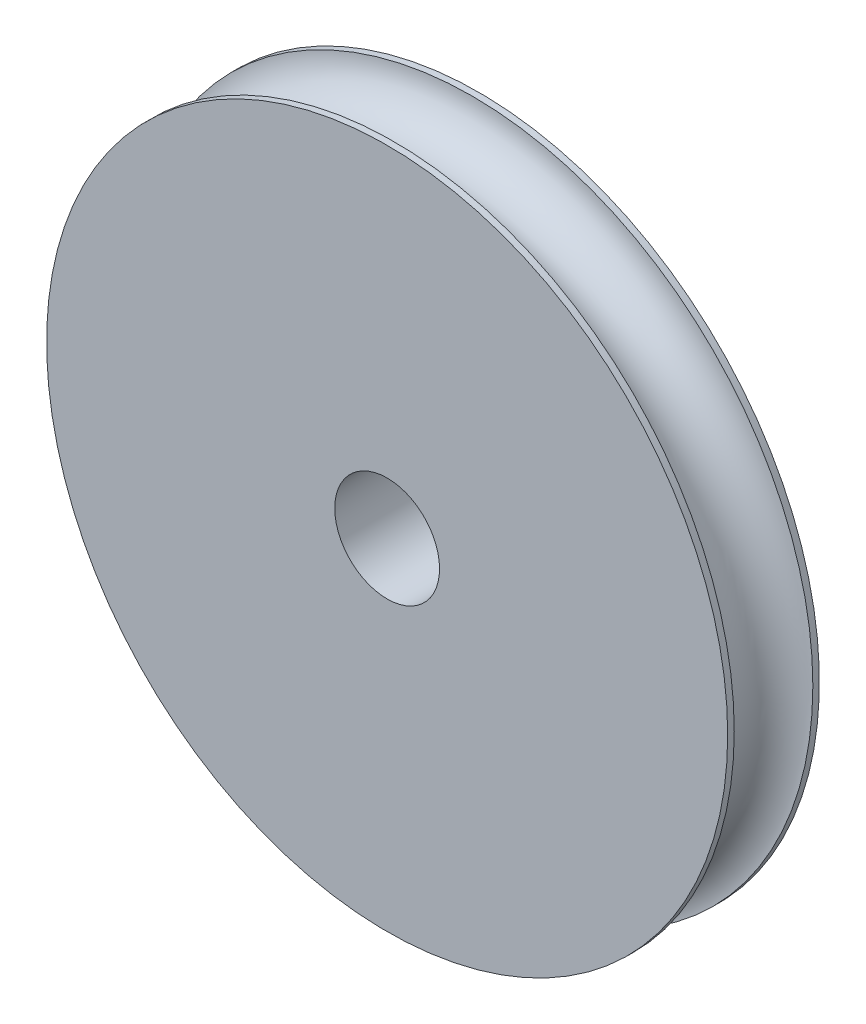
ISO-10303-21;
HEADER;
FILE_DESCRIPTION(('STEP AP214'),'2;1');
FILE_NAME('part.step','',(''),(''),'','','');
FILE_SCHEMA(('AUTOMOTIVE_DESIGN { 1 0 10303 214 1 1 1 1 }'));
ENDSEC;
DATA;
#1=APPLICATION_CONTEXT('core data for automotive mechanical design processes');
#2=APPLICATION_PROTOCOL_DEFINITION('international standard','automotive_design',2000,#1);
#3=PRODUCT_CONTEXT('',#1,'mechanical');
#4=PRODUCT('Part','Part','',(#3));
#5=PRODUCT_RELATED_PRODUCT_CATEGORY('part','',(#4));
#6=PRODUCT_DEFINITION_FORMATION('','',#4);
#7=PRODUCT_DEFINITION_CONTEXT('part definition',#1,'design');
#8=PRODUCT_DEFINITION('design','',#6,#7);
#9=PRODUCT_DEFINITION_SHAPE('','',#8);
#10=(LENGTH_UNIT() NAMED_UNIT(*) SI_UNIT(.MILLI.,.METRE.));
#11=(NAMED_UNIT(*) PLANE_ANGLE_UNIT() SI_UNIT($,.RADIAN.));
#12=(NAMED_UNIT(*) SI_UNIT($,.STERADIAN.) SOLID_ANGLE_UNIT());
#13=UNCERTAINTY_MEASURE_WITH_UNIT(LENGTH_MEASURE(1.E-05),#10,'distance_accuracy_value','');
#14=(GEOMETRIC_REPRESENTATION_CONTEXT(3) GLOBAL_UNCERTAINTY_ASSIGNED_CONTEXT((#13)) GLOBAL_UNIT_ASSIGNED_CONTEXT((#10,
#11,#12)) REPRESENTATION_CONTEXT('',''));
#15=CARTESIAN_POINT('',(0.,0.,0.));
#16=DIRECTION('',(0.,0.,1.));
#17=DIRECTION('',(1.,0.,0.));
#18=AXIS2_PLACEMENT_3D('',#15,#16,#17);
#19=CARTESIAN_POINT('',(0.,0.,-3.));
#20=DIRECTION('',(0.,0.,1.));
#21=DIRECTION('',(1.,0.,0.));
#22=AXIS2_PLACEMENT_3D('',#19,#20,#21);
#23=TOROIDAL_SURFACE('',#22,26.,3.);
#24=CARTESIAN_POINT('',(0.,0.,0.));
#25=DIRECTION('',(0.,0.,1.));
#26=DIRECTION('',(1.,0.,0.));
#27=AXIS2_PLACEMENT_3D('',#24,#25,#26);
#28=CIRCLE('',#27,26.);
#29=CARTESIAN_POINT('',(26.,0.,0.));
#30=VERTEX_POINT('',#29);
#31=EDGE_CURVE('E10',#30,#30,#28,.T.);
#32=ORIENTED_EDGE('',*,*,#31,.F.);
#33=EDGE_LOOP('',(#32));
#34=FACE_BOUND('',#33,.T.);
#35=CARTESIAN_POINT('',(0.,0.,-6.));
#36=DIRECTION('',(0.,0.,-1.));
#37=DIRECTION('',(-1.,0.,0.));
#38=AXIS2_PLACEMENT_3D('',#35,#36,#37);
#39=CIRCLE('',#38,26.);
#40=CARTESIAN_POINT('',(-26.,0.,-6.));
#41=VERTEX_POINT('',#40);
#42=EDGE_CURVE('E47',#41,#41,#39,.T.);
#43=ORIENTED_EDGE('',*,*,#42,.F.);
#44=EDGE_LOOP('',(#43));
#45=FACE_BOUND('',#44,.T.);
#46=ADVANCED_FACE('F33',(#34,#45),#23,.F.);
#47=CARTESIAN_POINT('',(0.,0.,0.5));
#48=DIRECTION('',(0.,0.,1.));
#49=DIRECTION('',(1.,0.,0.));
#50=AXIS2_PLACEMENT_3D('',#47,#48,#49);
#51=PLANE('',#50);
#52=CARTESIAN_POINT('',(0.,0.,0.5));
#53=DIRECTION('',(0.,0.,1.));
#54=DIRECTION('',(1.,0.,0.));
#55=AXIS2_PLACEMENT_3D('',#52,#53,#54);
#56=CIRCLE('',#55,4.);
#57=CARTESIAN_POINT('',(4.,0.,0.5));
#58=VERTEX_POINT('',#57);
#59=EDGE_CURVE('E51',#58,#58,#56,.T.);
#60=ORIENTED_EDGE('',*,*,#59,.F.);
#61=EDGE_LOOP('',(#60));
#62=FACE_BOUND('',#61,.T.);
#63=CARTESIAN_POINT('',(0.,0.,0.5));
#64=DIRECTION('',(0.,0.,1.));
#65=DIRECTION('',(1.,0.,0.));
#66=AXIS2_PLACEMENT_3D('',#63,#64,#65);
#67=CIRCLE('',#66,26.);
#68=CARTESIAN_POINT('',(26.,0.,0.5));
#69=VERTEX_POINT('',#68);
#70=EDGE_CURVE('E39',#69,#69,#67,.T.);
#71=ORIENTED_EDGE('',*,*,#70,.T.);
#72=EDGE_LOOP('',(#71));
#73=FACE_BOUND('',#72,.T.);
#74=ADVANCED_FACE('F75',(#62,#73),#51,.T.);
#75=CARTESIAN_POINT('',(0.,0.,0.5));
#76=DIRECTION('',(0.,0.,-1.));
#77=DIRECTION('',(-1.,0.,0.));
#78=AXIS2_PLACEMENT_3D('',#75,#76,#77);
#79=CYLINDRICAL_SURFACE('',#78,26.);
#80=ORIENTED_EDGE('',*,*,#70,.F.);
#81=EDGE_LOOP('',(#80));
#82=FACE_BOUND('',#81,.T.);
#83=ORIENTED_EDGE('',*,*,#31,.T.);
#84=EDGE_LOOP('',(#83));
#85=FACE_BOUND('',#84,.T.);
#86=ADVANCED_FACE('F70',(#82,#85),#79,.T.);
#87=CARTESIAN_POINT('',(0.,0.,-6.5));
#88=DIRECTION('',(0.,0.,1.));
#89=DIRECTION('',(1.,0.,0.));
#90=AXIS2_PLACEMENT_3D('',#87,#88,#89);
#91=CYLINDRICAL_SURFACE('',#90,26.);
#92=CARTESIAN_POINT('',(0.,0.,-6.5));
#93=DIRECTION('',(0.,0.,-1.));
#94=DIRECTION('',(-1.,0.,0.));
#95=AXIS2_PLACEMENT_3D('',#92,#93,#94);
#96=CIRCLE('',#95,26.);
#97=CARTESIAN_POINT('',(-26.,0.,-6.5));
#98=VERTEX_POINT('',#97);
#99=EDGE_CURVE('E43',#98,#98,#96,.T.);
#100=ORIENTED_EDGE('',*,*,#99,.F.);
#101=EDGE_LOOP('',(#100));
#102=FACE_BOUND('',#101,.T.);
#103=ORIENTED_EDGE('',*,*,#42,.T.);
#104=EDGE_LOOP('',(#103));
#105=FACE_BOUND('',#104,.T.);
#106=ADVANCED_FACE('F64',(#102,#105),#91,.T.);
#107=CARTESIAN_POINT('',(0.,0.,-6.5));
#108=DIRECTION('',(0.,0.,-1.));
#109=DIRECTION('',(-1.,0.,0.));
#110=AXIS2_PLACEMENT_3D('',#107,#108,#109);
#111=PLANE('',#110);
#112=CARTESIAN_POINT('',(0.,0.,-6.5));
#113=DIRECTION('',(0.,0.,-1.));
#114=DIRECTION('',(-1.,0.,0.));
#115=AXIS2_PLACEMENT_3D('',#112,#113,#114);
#116=CIRCLE('',#115,4.);
#117=CARTESIAN_POINT('',(-4.,0.,-6.5));
#118=VERTEX_POINT('',#117);
#119=EDGE_CURVE('E55',#118,#118,#116,.T.);
#120=ORIENTED_EDGE('',*,*,#119,.F.);
#121=EDGE_LOOP('',(#120));
#122=FACE_BOUND('',#121,.T.);
#123=ORIENTED_EDGE('',*,*,#99,.T.);
#124=EDGE_LOOP('',(#123));
#125=FACE_BOUND('',#124,.T.);
#126=ADVANCED_FACE('F61',(#122,#125),#111,.T.);
#127=CARTESIAN_POINT('',(0.,0.,3.5));
#128=DIRECTION('',(0.,0.,-1.));
#129=DIRECTION('',(-1.,0.,0.));
#130=AXIS2_PLACEMENT_3D('',#127,#128,#129);
#131=CYLINDRICAL_SURFACE('',#130,4.);
#132=ORIENTED_EDGE('',*,*,#59,.T.);
#133=EDGE_LOOP('',(#132));
#134=FACE_BOUND('',#133,.T.);
#135=ORIENTED_EDGE('',*,*,#119,.T.);
#136=EDGE_LOOP('',(#135));
#137=FACE_BOUND('',#136,.T.);
#138=ADVANCED_FACE('F59',(#134,#137),#131,.F.);
#139=CLOSED_SHELL('',(#46,#74,#86,#106,#126,#138));
#140=MANIFOLD_SOLID_BREP('B2',#139);
#141=ADVANCED_BREP_SHAPE_REPRESENTATION('',(#18,#140),#14);
#142=SHAPE_DEFINITION_REPRESENTATION(#9,#141);
ENDSEC;
END-ISO-10303-21;
